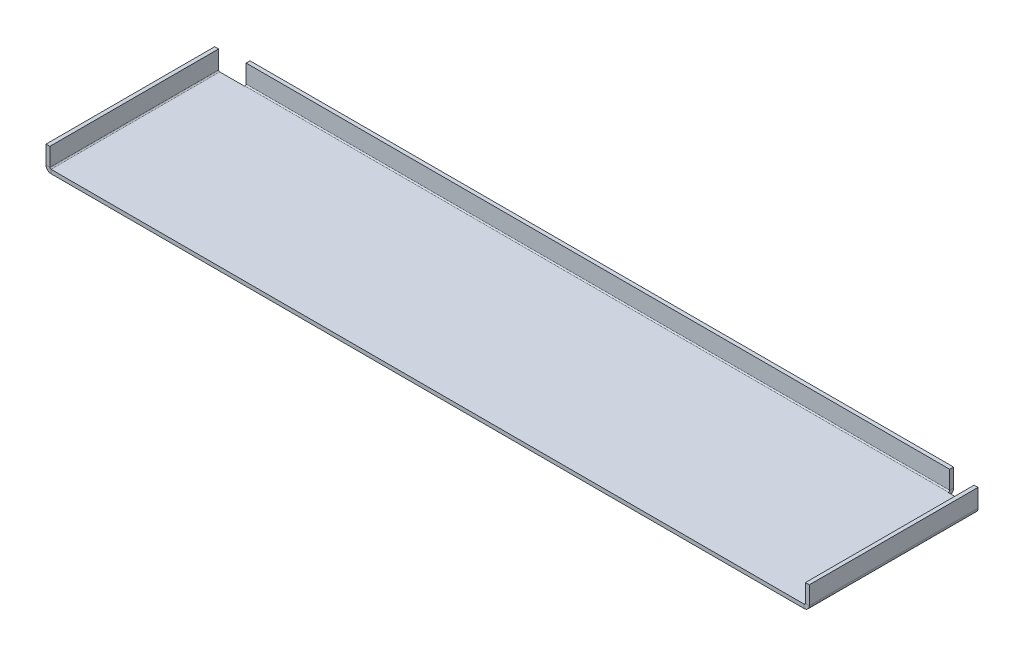
ISO-10303-21;
HEADER;
FILE_DESCRIPTION(('STEP AP214'),'2;1');
FILE_NAME('part.step','',(''),(''),'','','');
FILE_SCHEMA(('AUTOMOTIVE_DESIGN { 1 0 10303 214 1 1 1 1 }'));
ENDSEC;
DATA;
#1=APPLICATION_CONTEXT('core data for automotive mechanical design processes');
#2=APPLICATION_PROTOCOL_DEFINITION('international standard','automotive_design',2000,#1);
#3=PRODUCT_CONTEXT('',#1,'mechanical');
#4=PRODUCT('Part','Part','',(#3));
#5=PRODUCT_RELATED_PRODUCT_CATEGORY('part','',(#4));
#6=PRODUCT_DEFINITION_FORMATION('','',#4);
#7=PRODUCT_DEFINITION_CONTEXT('part definition',#1,'design');
#8=PRODUCT_DEFINITION('design','',#6,#7);
#9=PRODUCT_DEFINITION_SHAPE('','',#8);
#10=(LENGTH_UNIT() NAMED_UNIT(*) SI_UNIT(.MILLI.,.METRE.));
#11=(NAMED_UNIT(*) PLANE_ANGLE_UNIT() SI_UNIT($,.RADIAN.));
#12=(NAMED_UNIT(*) SI_UNIT($,.STERADIAN.) SOLID_ANGLE_UNIT());
#13=UNCERTAINTY_MEASURE_WITH_UNIT(LENGTH_MEASURE(1.E-05),#10,'distance_accuracy_value','');
#14=(GEOMETRIC_REPRESENTATION_CONTEXT(3) GLOBAL_UNCERTAINTY_ASSIGNED_CONTEXT((#13)) GLOBAL_UNIT_ASSIGNED_CONTEXT((#10,
#11,#12)) REPRESENTATION_CONTEXT('',''));
#15=CARTESIAN_POINT('',(0.,0.,0.));
#16=DIRECTION('',(0.,0.,1.));
#17=DIRECTION('',(1.,0.,0.));
#18=AXIS2_PLACEMENT_3D('',#15,#16,#17);
#19=CARTESIAN_POINT('',(-307.34,-3.175,-69.31025));
#20=DIRECTION('',(0.,0.,-1.));
#21=DIRECTION('',(-1.,0.,0.));
#22=AXIS2_PLACEMENT_3D('',#19,#20,#21);
#23=PLANE('',#22);
#24=DIRECTION('',(-1.,0.,0.));
#25=VECTOR('',#24,1.);
#26=CARTESIAN_POINT('',(-307.34,0.,-69.31025));
#27=LINE('',#26,#25);
#28=CARTESIAN_POINT('',(-289.068,0.,-69.31025));
#29=VERTEX_POINT('',#28);
#30=CARTESIAN_POINT('',(-309.388,0.,-69.31025));
#31=VERTEX_POINT('',#30);
#32=EDGE_CURVE('E421',#29,#31,#27,.T.);
#33=ORIENTED_EDGE('',*,*,#32,.F.);
#34=DIRECTION('',(0.,-1.,0.));
#35=VECTOR('',#34,1.);
#36=CARTESIAN_POINT('',(-289.068,0.,-69.31025));
#37=LINE('',#36,#35);
#38=CARTESIAN_POINT('',(-289.068,-3.175,-69.31025));
#39=VERTEX_POINT('',#38);
#40=EDGE_CURVE('E307',#29,#39,#37,.T.);
#41=ORIENTED_EDGE('',*,*,#40,.T.);
#42=DIRECTION('',(-1.,0.,0.));
#43=VECTOR('',#42,1.);
#44=CARTESIAN_POINT('',(-307.34,-3.175,-69.31025));
#45=LINE('',#44,#43);
#46=CARTESIAN_POINT('',(-309.388,-3.175,-69.31025));
#47=VERTEX_POINT('',#46);
#48=EDGE_CURVE('E120',#39,#47,#45,.T.);
#49=ORIENTED_EDGE('',*,*,#48,.T.);
#50=DIRECTION('',(0.,-1.,0.));
#51=VECTOR('',#50,1.);
#52=CARTESIAN_POINT('',(-309.388,0.,-69.31025));
#53=LINE('',#52,#51);
#54=EDGE_CURVE('E418',#31,#47,#53,.T.);
#55=ORIENTED_EDGE('',*,*,#54,.F.);
#56=EDGE_LOOP('',(#33,#41,#49,#55));
#57=FACE_BOUND('',#56,.T.);
#58=ADVANCED_FACE('F96',(#57),#23,.T.);
#59=CARTESIAN_POINT('',(-307.34,-3.175,69.31025));
#60=DIRECTION('',(0.,0.,1.));
#61=DIRECTION('',(1.,0.,0.));
#62=AXIS2_PLACEMENT_3D('',#59,#60,#61);
#63=PLANE('',#62);
#64=DIRECTION('',(1.,0.,0.));
#65=VECTOR('',#64,1.);
#66=CARTESIAN_POINT('',(-307.34,0.,69.31025));
#67=LINE('',#66,#65);
#68=CARTESIAN_POINT('',(-309.388,0.,69.31025));
#69=VERTEX_POINT('',#68);
#70=CARTESIAN_POINT('',(309.388,0.,69.31025));
#71=VERTEX_POINT('',#70);
#72=EDGE_CURVE('E100',#69,#71,#67,.T.);
#73=ORIENTED_EDGE('',*,*,#72,.F.);
#74=DIRECTION('',(0.,-1.,0.));
#75=VECTOR('',#74,1.);
#76=CARTESIAN_POINT('',(-309.388,0.,69.31025));
#77=LINE('',#76,#75);
#78=CARTESIAN_POINT('',(-309.388,-3.175,69.31025));
#79=VERTEX_POINT('',#78);
#80=EDGE_CURVE('E407',#69,#79,#77,.T.);
#81=ORIENTED_EDGE('',*,*,#80,.T.);
#82=DIRECTION('',(1.,0.,0.));
#83=VECTOR('',#82,1.);
#84=CARTESIAN_POINT('',(-307.34,-3.175,69.31025));
#85=LINE('',#84,#83);
#86=CARTESIAN_POINT('',(309.388,-3.175,69.31025));
#87=VERTEX_POINT('',#86);
#88=EDGE_CURVE('E13',#79,#87,#85,.T.);
#89=ORIENTED_EDGE('',*,*,#88,.T.);
#90=DIRECTION('',(0.,-1.,0.));
#91=VECTOR('',#90,1.);
#92=CARTESIAN_POINT('',(309.388,0.,69.31025));
#93=LINE('',#92,#91);
#94=EDGE_CURVE('E364',#71,#87,#93,.T.);
#95=ORIENTED_EDGE('',*,*,#94,.F.);
#96=EDGE_LOOP('',(#73,#81,#89,#95));
#97=FACE_BOUND('',#96,.T.);
#98=ADVANCED_FACE('F446',(#97),#63,.T.);
#99=DIRECTION('',(0.,-1.,0.));
#100=VECTOR('',#99,1.);
#101=CARTESIAN_POINT('',(289.068,0.,-69.31025));
#102=LINE('',#101,#100);
#103=CARTESIAN_POINT('',(289.068,0.,-69.31025));
#104=VERTEX_POINT('',#103);
#105=CARTESIAN_POINT('',(289.068,-3.175,-69.31025));
#106=VERTEX_POINT('',#105);
#107=EDGE_CURVE('E303',#104,#106,#102,.T.);
#108=ORIENTED_EDGE('',*,*,#107,.F.);
#109=CARTESIAN_POINT('',(309.388,0.,-69.31025));
#110=VERTEX_POINT('',#109);
#111=EDGE_CURVE('E425',#110,#104,#27,.T.);
#112=ORIENTED_EDGE('',*,*,#111,.F.);
#113=DIRECTION('',(0.,-1.,0.));
#114=VECTOR('',#113,1.);
#115=CARTESIAN_POINT('',(309.388,0.,-69.31025));
#116=LINE('',#115,#114);
#117=CARTESIAN_POINT('',(309.388,-3.175,-69.31025));
#118=VERTEX_POINT('',#117);
#119=EDGE_CURVE('E354',#110,#118,#116,.T.);
#120=ORIENTED_EDGE('',*,*,#119,.T.);
#121=EDGE_CURVE('E105',#118,#106,#45,.T.);
#122=ORIENTED_EDGE('',*,*,#121,.T.);
#123=EDGE_LOOP('',(#108,#112,#120,#122));
#124=FACE_BOUND('',#123,.T.);
#125=ADVANCED_FACE('F98',(#124),#23,.T.);
#126=CARTESIAN_POINT('',(0.,-3.175,0.));
#127=DIRECTION('',(0.,1.,0.));
#128=DIRECTION('',(0.,0.,1.));
#129=AXIS2_PLACEMENT_3D('',#126,#127,#128);
#130=PLANE('',#129);
#131=ORIENTED_EDGE('',*,*,#121,.F.);
#132=DIRECTION('',(0.,0.,-1.));
#133=VECTOR('',#132,1.);
#134=CARTESIAN_POINT('',(309.388,-3.175,-69.31025));
#135=LINE('',#134,#133);
#136=EDGE_CURVE('E347',#118,#87,#135,.F.);
#137=ORIENTED_EDGE('',*,*,#136,.T.);
#138=ORIENTED_EDGE('',*,*,#88,.F.);
#139=DIRECTION('',(0.,0.,1.));
#140=VECTOR('',#139,1.);
#141=CARTESIAN_POINT('',(-309.388,-3.175,69.31025));
#142=LINE('',#141,#140);
#143=EDGE_CURVE('E400',#79,#47,#142,.F.);
#144=ORIENTED_EDGE('',*,*,#143,.T.);
#145=ORIENTED_EDGE('',*,*,#48,.F.);
#146=DIRECTION('',(0.,0.,1.));
#147=VECTOR('',#146,1.);
#148=CARTESIAN_POINT('',(-289.068,-3.175,-69.58025));
#149=LINE('',#148,#147);
#150=CARTESIAN_POINT('',(-289.068,-3.175,-69.58025));
#151=VERTEX_POINT('',#150);
#152=EDGE_CURVE('E113',#151,#39,#149,.T.);
#153=ORIENTED_EDGE('',*,*,#152,.F.);
#154=DIRECTION('',(-1.,0.,0.));
#155=VECTOR('',#154,1.);
#156=CARTESIAN_POINT('',(-289.068,-3.175,-69.58025));
#157=LINE('',#156,#155);
#158=CARTESIAN_POINT('',(289.068,-3.175,-69.58025));
#159=VERTEX_POINT('',#158);
#160=EDGE_CURVE('E244',#151,#159,#157,.F.);
#161=ORIENTED_EDGE('',*,*,#160,.T.);
#162=DIRECTION('',(0.,0.,1.));
#163=VECTOR('',#162,1.);
#164=CARTESIAN_POINT('',(289.068,-3.175,-69.58025));
#165=LINE('',#164,#163);
#166=EDGE_CURVE('E310',#159,#106,#165,.T.);
#167=ORIENTED_EDGE('',*,*,#166,.T.);
#168=EDGE_LOOP('',(#131,#137,#138,#144,#145,#153,#161,#167));
#169=FACE_BOUND('',#168,.T.);
#170=ADVANCED_FACE('F452',(#169),#130,.F.);
#171=CARTESIAN_POINT('',(0.,0.,0.));
#172=DIRECTION('',(0.,1.,0.));
#173=DIRECTION('',(0.,0.,1.));
#174=AXIS2_PLACEMENT_3D('',#171,#172,#173);
#175=PLANE('',#174);
#176=ORIENTED_EDGE('',*,*,#72,.T.);
#177=DIRECTION('',(0.,0.,-1.));
#178=VECTOR('',#177,1.);
#179=CARTESIAN_POINT('',(309.388,0.,-69.31025));
#180=LINE('',#179,#178);
#181=EDGE_CURVE('E360',#110,#71,#180,.F.);
#182=ORIENTED_EDGE('',*,*,#181,.F.);
#183=ORIENTED_EDGE('',*,*,#111,.T.);
#184=DIRECTION('',(0.,0.,1.));
#185=VECTOR('',#184,1.);
#186=CARTESIAN_POINT('',(289.068,0.,-69.58025));
#187=LINE('',#186,#185);
#188=CARTESIAN_POINT('',(289.068,0.,-69.58025));
#189=VERTEX_POINT('',#188);
#190=EDGE_CURVE('E309',#189,#104,#187,.T.);
#191=ORIENTED_EDGE('',*,*,#190,.F.);
#192=DIRECTION('',(-1.,0.,0.));
#193=VECTOR('',#192,1.);
#194=CARTESIAN_POINT('',(-289.068,0.,-69.58025));
#195=LINE('',#194,#193);
#196=CARTESIAN_POINT('',(-289.068,0.,-69.58025));
#197=VERTEX_POINT('',#196);
#198=EDGE_CURVE('E297',#197,#189,#195,.F.);
#199=ORIENTED_EDGE('',*,*,#198,.F.);
#200=DIRECTION('',(0.,0.,1.));
#201=VECTOR('',#200,1.);
#202=CARTESIAN_POINT('',(-289.068,0.,-69.58025));
#203=LINE('',#202,#201);
#204=EDGE_CURVE('E313',#197,#29,#203,.T.);
#205=ORIENTED_EDGE('',*,*,#204,.T.);
#206=ORIENTED_EDGE('',*,*,#32,.T.);
#207=DIRECTION('',(0.,0.,1.));
#208=VECTOR('',#207,1.);
#209=CARTESIAN_POINT('',(-309.388,0.,69.31025));
#210=LINE('',#209,#208);
#211=EDGE_CURVE('E413',#69,#31,#210,.F.);
#212=ORIENTED_EDGE('',*,*,#211,.F.);
#213=EDGE_LOOP('',(#176,#182,#183,#191,#199,#205,#206,#212));
#214=FACE_BOUND('',#213,.T.);
#215=ADVANCED_FACE('F434',(#214),#175,.T.);
#216=CARTESIAN_POINT('',(-309.388,1.,-69.31025));
#217=DIRECTION('',(0.,0.,-1.));
#218=DIRECTION('',(-1.,0.,0.));
#219=AXIS2_PLACEMENT_3D('',#216,#217,#218);
#220=PLANE('',#219);
#221=DIRECTION('',(1.,0.,0.));
#222=VECTOR('',#221,1.);
#223=CARTESIAN_POINT('',(-313.563,0.99999999999999,-69.31025));
#224=LINE('',#223,#222);
#225=CARTESIAN_POINT('',(-310.388,1.,-69.31025));
#226=VERTEX_POINT('',#225);
#227=CARTESIAN_POINT('',(-313.563,0.99999999999999,-69.31025));
#228=VERTEX_POINT('',#227);
#229=EDGE_CURVE('E367',#226,#228,#224,.F.);
#230=ORIENTED_EDGE('',*,*,#229,.F.);
#231=CARTESIAN_POINT('',(-309.388,1.,-69.31025));
#232=DIRECTION('',(0.,0.,1.));
#233=DIRECTION('',(1.,0.,0.));
#234=AXIS2_PLACEMENT_3D('',#231,#232,#233);
#235=CIRCLE('',#234,1.);
#236=EDGE_CURVE('E410',#31,#226,#235,.F.);
#237=ORIENTED_EDGE('',*,*,#236,.F.);
#238=ORIENTED_EDGE('',*,*,#54,.T.);
#239=CARTESIAN_POINT('',(-309.388,1.,-69.31025));
#240=DIRECTION('',(0.,0.,1.));
#241=DIRECTION('',(1.,0.,0.));
#242=AXIS2_PLACEMENT_3D('',#239,#240,#241);
#243=CIRCLE('',#242,4.175);
#244=EDGE_CURVE('E403',#47,#228,#243,.F.);
#245=ORIENTED_EDGE('',*,*,#244,.T.);
#246=EDGE_LOOP('',(#230,#237,#238,#245));
#247=FACE_BOUND('',#246,.T.);
#248=ADVANCED_FACE('F444',(#247),#220,.T.);
#249=CARTESIAN_POINT('',(-309.388,1.,69.31025));
#250=DIRECTION('',(0.,0.,-1.));
#251=DIRECTION('',(-1.,0.,0.));
#252=AXIS2_PLACEMENT_3D('',#249,#250,#251);
#253=PLANE('',#252);
#254=CARTESIAN_POINT('',(-309.388,1.,69.31025));
#255=DIRECTION('',(0.,0.,1.));
#256=DIRECTION('',(1.,0.,0.));
#257=AXIS2_PLACEMENT_3D('',#254,#255,#256);
#258=CIRCLE('',#257,1.);
#259=CARTESIAN_POINT('',(-310.388,1.,69.31025));
#260=VERTEX_POINT('',#259);
#261=EDGE_CURVE('E373',#260,#69,#258,.T.);
#262=ORIENTED_EDGE('',*,*,#261,.F.);
#263=DIRECTION('',(1.,0.,0.));
#264=VECTOR('',#263,1.);
#265=CARTESIAN_POINT('',(-310.388,1.,69.31025));
#266=LINE('',#265,#264);
#267=CARTESIAN_POINT('',(-313.563,0.99999999999999,69.31025));
#268=VERTEX_POINT('',#267);
#269=EDGE_CURVE('E393',#260,#268,#266,.F.);
#270=ORIENTED_EDGE('',*,*,#269,.T.);
#271=CARTESIAN_POINT('',(-309.388,1.,69.31025));
#272=DIRECTION('',(0.,0.,1.));
#273=DIRECTION('',(1.,0.,0.));
#274=AXIS2_PLACEMENT_3D('',#271,#272,#273);
#275=CIRCLE('',#274,4.175);
#276=EDGE_CURVE('E404',#268,#79,#275,.T.);
#277=ORIENTED_EDGE('',*,*,#276,.T.);
#278=ORIENTED_EDGE('',*,*,#80,.F.);
#279=EDGE_LOOP('',(#262,#270,#277,#278));
#280=FACE_BOUND('',#279,.T.);
#281=ADVANCED_FACE('F562',(#280),#253,.F.);
#282=CARTESIAN_POINT('',(-309.388,1.,69.31025));
#283=DIRECTION('',(0.,0.,1.));
#284=DIRECTION('',(-1.,0.,0.));
#285=AXIS2_PLACEMENT_3D('',#282,#283,#284);
#286=CYLINDRICAL_SURFACE('',#285,4.175);
#287=ORIENTED_EDGE('',*,*,#143,.F.);
#288=ORIENTED_EDGE('',*,*,#276,.F.);
#289=DIRECTION('',(0.,0.,1.));
#290=VECTOR('',#289,1.);
#291=CARTESIAN_POINT('',(-313.563,0.99999999999999,-69.31025));
#292=LINE('',#291,#290);
#293=EDGE_CURVE('E391',#268,#228,#292,.F.);
#294=ORIENTED_EDGE('',*,*,#293,.T.);
#295=ORIENTED_EDGE('',*,*,#244,.F.);
#296=EDGE_LOOP('',(#287,#288,#294,#295));
#297=FACE_BOUND('',#296,.T.);
#298=ADVANCED_FACE('F559',(#297),#286,.T.);
#299=CARTESIAN_POINT('',(-309.388,1.,69.31025));
#300=DIRECTION('',(0.,0.,1.));
#301=DIRECTION('',(-1.,0.,0.));
#302=AXIS2_PLACEMENT_3D('',#299,#300,#301);
#303=CYLINDRICAL_SURFACE('',#302,1.);
#304=ORIENTED_EDGE('',*,*,#211,.T.);
#305=ORIENTED_EDGE('',*,*,#236,.T.);
#306=DIRECTION('',(0.,0.,1.));
#307=VECTOR('',#306,1.);
#308=CARTESIAN_POINT('',(-310.388,1.,-69.31025));
#309=LINE('',#308,#307);
#310=EDGE_CURVE('E396',#226,#260,#309,.T.);
#311=ORIENTED_EDGE('',*,*,#310,.T.);
#312=ORIENTED_EDGE('',*,*,#261,.T.);
#313=EDGE_LOOP('',(#304,#305,#311,#312));
#314=FACE_BOUND('',#313,.T.);
#315=ADVANCED_FACE('F439',(#314),#303,.F.);
#316=CARTESIAN_POINT('',(-313.563,0.,-69.31025));
#317=DIRECTION('',(0.,0.,1.));
#318=DIRECTION('',(0.,-1.,0.));
#319=AXIS2_PLACEMENT_3D('',#316,#317,#318);
#320=PLANE('',#319);
#321=ORIENTED_EDGE('',*,*,#229,.T.);
#322=DIRECTION('',(0.,-1.,0.));
#323=VECTOR('',#322,1.);
#324=CARTESIAN_POINT('',(-313.563,-1.32814302736365E-12,-69.31025));
#325=LINE('',#324,#323);
#326=CARTESIAN_POINT('',(-313.563,15.875,-69.31025));
#327=VERTEX_POINT('',#326);
#328=EDGE_CURVE('E381',#327,#228,#325,.T.);
#329=ORIENTED_EDGE('',*,*,#328,.F.);
#330=DIRECTION('',(1.,0.,0.));
#331=VECTOR('',#330,1.);
#332=CARTESIAN_POINT('',(-313.563,15.875,-69.31025));
#333=LINE('',#332,#331);
#334=CARTESIAN_POINT('',(-310.388,15.875,-69.31025));
#335=VERTEX_POINT('',#334);
#336=EDGE_CURVE('E374',#327,#335,#333,.T.);
#337=ORIENTED_EDGE('',*,*,#336,.T.);
#338=DIRECTION('',(0.,1.,0.));
#339=VECTOR('',#338,1.);
#340=CARTESIAN_POINT('',(-310.388,0.,-69.31025));
#341=LINE('',#340,#339);
#342=EDGE_CURVE('E388',#335,#226,#341,.F.);
#343=ORIENTED_EDGE('',*,*,#342,.T.);
#344=EDGE_LOOP('',(#321,#329,#337,#343));
#345=FACE_BOUND('',#344,.T.);
#346=ADVANCED_FACE('F554',(#345),#320,.F.);
#347=CARTESIAN_POINT('',(-313.563,15.875,69.3102499999999));
#348=DIRECTION('',(0.,0.,-1.));
#349=DIRECTION('',(0.,1.,0.));
#350=AXIS2_PLACEMENT_3D('',#347,#348,#349);
#351=PLANE('',#350);
#352=ORIENTED_EDGE('',*,*,#269,.F.);
#353=DIRECTION('',(0.,-1.,0.));
#354=VECTOR('',#353,1.);
#355=CARTESIAN_POINT('',(-310.388,15.875,69.3102499999999));
#356=LINE('',#355,#354);
#357=CARTESIAN_POINT('',(-310.388,15.875,69.3102499999999));
#358=VERTEX_POINT('',#357);
#359=EDGE_CURVE('E386',#260,#358,#356,.F.);
#360=ORIENTED_EDGE('',*,*,#359,.T.);
#361=DIRECTION('',(1.,0.,0.));
#362=VECTOR('',#361,1.);
#363=CARTESIAN_POINT('',(-313.563,15.875,69.3102499999999));
#364=LINE('',#363,#362);
#365=CARTESIAN_POINT('',(-313.563,15.875,69.3102499999999));
#366=VERTEX_POINT('',#365);
#367=EDGE_CURVE('E370',#366,#358,#364,.T.);
#368=ORIENTED_EDGE('',*,*,#367,.F.);
#369=DIRECTION('',(0.,1.,0.));
#370=VECTOR('',#369,1.);
#371=CARTESIAN_POINT('',(-313.563,-8.43419654812306E-13,69.31025));
#372=LINE('',#371,#370);
#373=EDGE_CURVE('E379',#268,#366,#372,.T.);
#374=ORIENTED_EDGE('',*,*,#373,.F.);
#375=EDGE_LOOP('',(#352,#360,#368,#374));
#376=FACE_BOUND('',#375,.T.);
#377=ADVANCED_FACE('F544',(#376),#351,.F.);
#378=CARTESIAN_POINT('',(-313.563,-1.08578134108798E-12,0.));
#379=DIRECTION('',(1.,0.,0.));
#380=DIRECTION('',(0.,1.,0.));
#381=AXIS2_PLACEMENT_3D('',#378,#379,#380);
#382=PLANE('',#381);
#383=ORIENTED_EDGE('',*,*,#293,.F.);
#384=ORIENTED_EDGE('',*,*,#373,.T.);
#385=DIRECTION('',(0.,0.,-1.));
#386=VECTOR('',#385,1.);
#387=CARTESIAN_POINT('',(-313.563,15.875,0.));
#388=LINE('',#387,#386);
#389=EDGE_CURVE('E377',#366,#327,#388,.T.);
#390=ORIENTED_EDGE('',*,*,#389,.T.);
#391=ORIENTED_EDGE('',*,*,#328,.T.);
#392=EDGE_LOOP('',(#383,#384,#390,#391));
#393=FACE_BOUND('',#392,.T.);
#394=ADVANCED_FACE('F540',(#393),#382,.F.);
#395=CARTESIAN_POINT('',(-310.388,-1.07469588783715E-12,0.));
#396=DIRECTION('',(1.,0.,0.));
#397=DIRECTION('',(0.,1.,0.));
#398=AXIS2_PLACEMENT_3D('',#395,#396,#397);
#399=PLANE('',#398);
#400=ORIENTED_EDGE('',*,*,#359,.F.);
#401=ORIENTED_EDGE('',*,*,#310,.F.);
#402=ORIENTED_EDGE('',*,*,#342,.F.);
#403=DIRECTION('',(0.,0.,1.));
#404=VECTOR('',#403,1.);
#405=CARTESIAN_POINT('',(-310.388,15.875,-69.31025));
#406=LINE('',#405,#404);
#407=EDGE_CURVE('E384',#358,#335,#406,.F.);
#408=ORIENTED_EDGE('',*,*,#407,.F.);
#409=EDGE_LOOP('',(#400,#401,#402,#408));
#410=FACE_BOUND('',#409,.T.);
#411=ADVANCED_FACE('F543',(#410),#399,.T.);
#412=CARTESIAN_POINT('',(-313.563,15.875,-69.31025));
#413=DIRECTION('',(0.,-1.,0.));
#414=DIRECTION('',(1.,0.,0.));
#415=AXIS2_PLACEMENT_3D('',#412,#413,#414);
#416=PLANE('',#415);
#417=ORIENTED_EDGE('',*,*,#407,.T.);
#418=ORIENTED_EDGE('',*,*,#336,.F.);
#419=ORIENTED_EDGE('',*,*,#389,.F.);
#420=ORIENTED_EDGE('',*,*,#367,.T.);
#421=EDGE_LOOP('',(#417,#418,#419,#420));
#422=FACE_BOUND('',#421,.T.);
#423=ADVANCED_FACE('F535',(#422),#416,.F.);
#424=CARTESIAN_POINT('',(309.388,1.,69.31025));
#425=DIRECTION('',(0.,0.,1.));
#426=DIRECTION('',(1.,0.,0.));
#427=AXIS2_PLACEMENT_3D('',#424,#425,#426);
#428=PLANE('',#427);
#429=DIRECTION('',(-1.,0.,0.));
#430=VECTOR('',#429,1.);
#431=CARTESIAN_POINT('',(313.563,0.99999999999999,69.31025));
#432=LINE('',#431,#430);
#433=CARTESIAN_POINT('',(310.388,1.,69.31025));
#434=VERTEX_POINT('',#433);
#435=CARTESIAN_POINT('',(313.563,0.99999999999999,69.31025));
#436=VERTEX_POINT('',#435);
#437=EDGE_CURVE('E315',#434,#436,#432,.F.);
#438=ORIENTED_EDGE('',*,*,#437,.F.);
#439=CARTESIAN_POINT('',(309.388,1.,69.31025));
#440=DIRECTION('',(0.,0.,-1.));
#441=DIRECTION('',(-1.,0.,0.));
#442=AXIS2_PLACEMENT_3D('',#439,#440,#441);
#443=CIRCLE('',#442,1.);
#444=EDGE_CURVE('E357',#71,#434,#443,.F.);
#445=ORIENTED_EDGE('',*,*,#444,.F.);
#446=ORIENTED_EDGE('',*,*,#94,.T.);
#447=CARTESIAN_POINT('',(309.388,1.,69.31025));
#448=DIRECTION('',(0.,0.,-1.));
#449=DIRECTION('',(-1.,0.,0.));
#450=AXIS2_PLACEMENT_3D('',#447,#448,#449);
#451=CIRCLE('',#450,4.175);
#452=EDGE_CURVE('E350',#87,#436,#451,.F.);
#453=ORIENTED_EDGE('',*,*,#452,.T.);
#454=EDGE_LOOP('',(#438,#445,#446,#453));
#455=FACE_BOUND('',#454,.T.);
#456=ADVANCED_FACE('F532',(#455),#428,.T.);
#457=CARTESIAN_POINT('',(309.388,1.,-69.31025));
#458=DIRECTION('',(0.,0.,1.));
#459=DIRECTION('',(1.,0.,0.));
#460=AXIS2_PLACEMENT_3D('',#457,#458,#459);
#461=PLANE('',#460);
#462=CARTESIAN_POINT('',(309.388,1.,-69.31025));
#463=DIRECTION('',(0.,0.,-1.));
#464=DIRECTION('',(-1.,0.,0.));
#465=AXIS2_PLACEMENT_3D('',#462,#463,#464);
#466=CIRCLE('',#465,1.);
#467=CARTESIAN_POINT('',(310.388,1.,-69.31025));
#468=VERTEX_POINT('',#467);
#469=EDGE_CURVE('E320',#468,#110,#466,.T.);
#470=ORIENTED_EDGE('',*,*,#469,.F.);
#471=DIRECTION('',(-1.,0.,0.));
#472=VECTOR('',#471,1.);
#473=CARTESIAN_POINT('',(310.388,1.,-69.31025));
#474=LINE('',#473,#472);
#475=CARTESIAN_POINT('',(313.563,0.99999999999999,-69.31025));
#476=VERTEX_POINT('',#475);
#477=EDGE_CURVE('E340',#468,#476,#474,.F.);
#478=ORIENTED_EDGE('',*,*,#477,.T.);
#479=CARTESIAN_POINT('',(309.388,1.,-69.31025));
#480=DIRECTION('',(0.,0.,-1.));
#481=DIRECTION('',(-1.,0.,0.));
#482=AXIS2_PLACEMENT_3D('',#479,#480,#481);
#483=CIRCLE('',#482,4.175);
#484=EDGE_CURVE('E351',#476,#118,#483,.T.);
#485=ORIENTED_EDGE('',*,*,#484,.T.);
#486=ORIENTED_EDGE('',*,*,#119,.F.);
#487=EDGE_LOOP('',(#470,#478,#485,#486));
#488=FACE_BOUND('',#487,.T.);
#489=ADVANCED_FACE('F527',(#488),#461,.F.);
#490=CARTESIAN_POINT('',(309.388,1.,-69.31025));
#491=DIRECTION('',(0.,0.,-1.));
#492=DIRECTION('',(1.,0.,0.));
#493=AXIS2_PLACEMENT_3D('',#490,#491,#492);
#494=CYLINDRICAL_SURFACE('',#493,4.175);
#495=ORIENTED_EDGE('',*,*,#136,.F.);
#496=ORIENTED_EDGE('',*,*,#484,.F.);
#497=DIRECTION('',(0.,0.,-1.));
#498=VECTOR('',#497,1.);
#499=CARTESIAN_POINT('',(313.563,0.99999999999999,69.31025));
#500=LINE('',#499,#498);
#501=EDGE_CURVE('E338',#476,#436,#500,.F.);
#502=ORIENTED_EDGE('',*,*,#501,.T.);
#503=ORIENTED_EDGE('',*,*,#452,.F.);
#504=EDGE_LOOP('',(#495,#496,#502,#503));
#505=FACE_BOUND('',#504,.T.);
#506=ADVANCED_FACE('F524',(#505),#494,.T.);
#507=CARTESIAN_POINT('',(309.388,1.,-69.31025));
#508=DIRECTION('',(0.,0.,-1.));
#509=DIRECTION('',(1.,0.,0.));
#510=AXIS2_PLACEMENT_3D('',#507,#508,#509);
#511=CYLINDRICAL_SURFACE('',#510,1.);
#512=ORIENTED_EDGE('',*,*,#181,.T.);
#513=ORIENTED_EDGE('',*,*,#444,.T.);
#514=DIRECTION('',(0.,0.,-1.));
#515=VECTOR('',#514,1.);
#516=CARTESIAN_POINT('',(310.388,1.,69.31025));
#517=LINE('',#516,#515);
#518=EDGE_CURVE('E343',#434,#468,#517,.T.);
#519=ORIENTED_EDGE('',*,*,#518,.T.);
#520=ORIENTED_EDGE('',*,*,#469,.T.);
#521=EDGE_LOOP('',(#512,#513,#519,#520));
#522=FACE_BOUND('',#521,.T.);
#523=ADVANCED_FACE('F522',(#522),#511,.F.);
#524=CARTESIAN_POINT('',(313.563,0.,69.31025));
#525=DIRECTION('',(0.,0.,-1.));
#526=DIRECTION('',(0.,1.,0.));
#527=AXIS2_PLACEMENT_3D('',#524,#525,#526);
#528=PLANE('',#527);
#529=ORIENTED_EDGE('',*,*,#437,.T.);
#530=DIRECTION('',(0.,-1.,0.));
#531=VECTOR('',#530,1.);
#532=CARTESIAN_POINT('',(313.563,-1.32814302736365E-12,69.31025));
#533=LINE('',#532,#531);
#534=CARTESIAN_POINT('',(313.563,15.875,69.31025));
#535=VERTEX_POINT('',#534);
#536=EDGE_CURVE('E328',#535,#436,#533,.T.);
#537=ORIENTED_EDGE('',*,*,#536,.F.);
#538=DIRECTION('',(-1.,0.,0.));
#539=VECTOR('',#538,1.);
#540=CARTESIAN_POINT('',(313.563,15.875,69.31025));
#541=LINE('',#540,#539);
#542=CARTESIAN_POINT('',(310.388,15.875,69.31025));
#543=VERTEX_POINT('',#542);
#544=EDGE_CURVE('E321',#535,#543,#541,.T.);
#545=ORIENTED_EDGE('',*,*,#544,.T.);
#546=DIRECTION('',(0.,1.,0.));
#547=VECTOR('',#546,1.);
#548=CARTESIAN_POINT('',(310.388,0.,69.31025));
#549=LINE('',#548,#547);
#550=EDGE_CURVE('E335',#543,#434,#549,.F.);
#551=ORIENTED_EDGE('',*,*,#550,.T.);
#552=EDGE_LOOP('',(#529,#537,#545,#551));
#553=FACE_BOUND('',#552,.T.);
#554=ADVANCED_FACE('F518',(#553),#528,.F.);
#555=CARTESIAN_POINT('',(313.563,15.875,-69.3102499999999));
#556=DIRECTION('',(0.,0.,1.));
#557=DIRECTION('',(0.,-1.,0.));
#558=AXIS2_PLACEMENT_3D('',#555,#556,#557);
#559=PLANE('',#558);
#560=ORIENTED_EDGE('',*,*,#477,.F.);
#561=DIRECTION('',(0.,-1.,0.));
#562=VECTOR('',#561,1.);
#563=CARTESIAN_POINT('',(310.388,15.875,-69.3102499999999));
#564=LINE('',#563,#562);
#565=CARTESIAN_POINT('',(310.388,15.875,-69.3102499999999));
#566=VERTEX_POINT('',#565);
#567=EDGE_CURVE('E333',#468,#566,#564,.F.);
#568=ORIENTED_EDGE('',*,*,#567,.T.);
#569=DIRECTION('',(-1.,0.,0.));
#570=VECTOR('',#569,1.);
#571=CARTESIAN_POINT('',(313.563,15.875,-69.3102499999999));
#572=LINE('',#571,#570);
#573=CARTESIAN_POINT('',(313.563,15.875,-69.3102499999999));
#574=VERTEX_POINT('',#573);
#575=EDGE_CURVE('E317',#574,#566,#572,.T.);
#576=ORIENTED_EDGE('',*,*,#575,.F.);
#577=DIRECTION('',(0.,1.,0.));
#578=VECTOR('',#577,1.);
#579=CARTESIAN_POINT('',(313.563,-8.43419654812306E-13,-69.31025));
#580=LINE('',#579,#578);
#581=EDGE_CURVE('E326',#476,#574,#580,.T.);
#582=ORIENTED_EDGE('',*,*,#581,.F.);
#583=EDGE_LOOP('',(#560,#568,#576,#582));
#584=FACE_BOUND('',#583,.T.);
#585=ADVANCED_FACE('F508',(#584),#559,.F.);
#586=CARTESIAN_POINT('',(313.563,-1.08578134108798E-12,0.));
#587=DIRECTION('',(-1.,0.,0.));
#588=DIRECTION('',(0.,-1.,0.));
#589=AXIS2_PLACEMENT_3D('',#586,#587,#588);
#590=PLANE('',#589);
#591=ORIENTED_EDGE('',*,*,#501,.F.);
#592=ORIENTED_EDGE('',*,*,#581,.T.);
#593=DIRECTION('',(0.,0.,1.));
#594=VECTOR('',#593,1.);
#595=CARTESIAN_POINT('',(313.563,15.875,0.));
#596=LINE('',#595,#594);
#597=EDGE_CURVE('E324',#574,#535,#596,.T.);
#598=ORIENTED_EDGE('',*,*,#597,.T.);
#599=ORIENTED_EDGE('',*,*,#536,.T.);
#600=EDGE_LOOP('',(#591,#592,#598,#599));
#601=FACE_BOUND('',#600,.T.);
#602=ADVANCED_FACE('F504',(#601),#590,.F.);
#603=CARTESIAN_POINT('',(310.388,-1.07469588783715E-12,0.));
#604=DIRECTION('',(-1.,0.,0.));
#605=DIRECTION('',(0.,-1.,0.));
#606=AXIS2_PLACEMENT_3D('',#603,#604,#605);
#607=PLANE('',#606);
#608=ORIENTED_EDGE('',*,*,#567,.F.);
#609=ORIENTED_EDGE('',*,*,#518,.F.);
#610=ORIENTED_EDGE('',*,*,#550,.F.);
#611=DIRECTION('',(0.,0.,-1.));
#612=VECTOR('',#611,1.);
#613=CARTESIAN_POINT('',(310.388,15.875,69.31025));
#614=LINE('',#613,#612);
#615=EDGE_CURVE('E331',#566,#543,#614,.F.);
#616=ORIENTED_EDGE('',*,*,#615,.F.);
#617=EDGE_LOOP('',(#608,#609,#610,#616));
#618=FACE_BOUND('',#617,.T.);
#619=ADVANCED_FACE('F507',(#618),#607,.T.);
#620=CARTESIAN_POINT('',(313.563,15.875,69.31025));
#621=DIRECTION('',(0.,-1.,0.));
#622=DIRECTION('',(1.,0.,0.));
#623=AXIS2_PLACEMENT_3D('',#620,#621,#622);
#624=PLANE('',#623);
#625=ORIENTED_EDGE('',*,*,#615,.T.);
#626=ORIENTED_EDGE('',*,*,#544,.F.);
#627=ORIENTED_EDGE('',*,*,#597,.F.);
#628=ORIENTED_EDGE('',*,*,#575,.T.);
#629=EDGE_LOOP('',(#625,#626,#627,#628));
#630=FACE_BOUND('',#629,.T.);
#631=ADVANCED_FACE('F503',(#630),#624,.F.);
#632=CARTESIAN_POINT('',(-289.068,0.,-69.58025));
#633=DIRECTION('',(-1.,0.,0.));
#634=DIRECTION('',(0.,-1.,0.));
#635=AXIS2_PLACEMENT_3D('',#632,#633,#634);
#636=PLANE('',#635);
#637=ORIENTED_EDGE('',*,*,#204,.F.);
#638=DIRECTION('',(0.,-1.,0.));
#639=VECTOR('',#638,1.);
#640=CARTESIAN_POINT('',(-289.068,0.,-69.58025));
#641=LINE('',#640,#639);
#642=EDGE_CURVE('E293',#197,#151,#641,.T.);
#643=ORIENTED_EDGE('',*,*,#642,.T.);
#644=ORIENTED_EDGE('',*,*,#152,.T.);
#645=ORIENTED_EDGE('',*,*,#40,.F.);
#646=EDGE_LOOP('',(#637,#643,#644,#645));
#647=FACE_BOUND('',#646,.T.);
#648=ADVANCED_FACE('F500',(#647),#636,.T.);
#649=CARTESIAN_POINT('',(289.068,0.,-69.58025));
#650=DIRECTION('',(-1.,0.,0.));
#651=DIRECTION('',(0.,-1.,0.));
#652=AXIS2_PLACEMENT_3D('',#649,#650,#651);
#653=PLANE('',#652);
#654=ORIENTED_EDGE('',*,*,#166,.F.);
#655=DIRECTION('',(0.,-1.,0.));
#656=VECTOR('',#655,1.);
#657=CARTESIAN_POINT('',(289.068,0.,-69.58025));
#658=LINE('',#657,#656);
#659=EDGE_CURVE('E300',#189,#159,#658,.T.);
#660=ORIENTED_EDGE('',*,*,#659,.F.);
#661=ORIENTED_EDGE('',*,*,#190,.T.);
#662=ORIENTED_EDGE('',*,*,#107,.T.);
#663=EDGE_LOOP('',(#654,#660,#661,#662));
#664=FACE_BOUND('',#663,.T.);
#665=ADVANCED_FACE('F463',(#664),#653,.F.);
#666=CARTESIAN_POINT('',(289.068,1.,-69.58025));
#667=DIRECTION('',(1.,0.,0.));
#668=DIRECTION('',(0.,0.,-1.));
#669=AXIS2_PLACEMENT_3D('',#666,#667,#668);
#670=PLANE('',#669);
#671=DIRECTION('',(0.,0.,-1.));
#672=VECTOR('',#671,1.);
#673=CARTESIAN_POINT('',(289.068,1.00000000000002,-73.7552500000001));
#674=LINE('',#673,#672);
#675=CARTESIAN_POINT('',(289.068,1.,-70.58025));
#676=VERTEX_POINT('',#675);
#677=CARTESIAN_POINT('',(289.068,1.,-73.75525));
#678=VERTEX_POINT('',#677);
#679=EDGE_CURVE('E288',#676,#678,#674,.T.);
#680=ORIENTED_EDGE('',*,*,#679,.F.);
#681=CARTESIAN_POINT('',(289.068,1.,-69.58025));
#682=DIRECTION('',(-1.,0.,0.));
#683=DIRECTION('',(0.,0.,1.));
#684=AXIS2_PLACEMENT_3D('',#681,#682,#683);
#685=CIRCLE('',#684,1.);
#686=EDGE_CURVE('E246',#189,#676,#685,.F.);
#687=ORIENTED_EDGE('',*,*,#686,.F.);
#688=ORIENTED_EDGE('',*,*,#659,.T.);
#689=CARTESIAN_POINT('',(289.068,1.,-69.58025));
#690=DIRECTION('',(-1.,0.,0.));
#691=DIRECTION('',(0.,0.,1.));
#692=AXIS2_PLACEMENT_3D('',#689,#690,#691);
#693=CIRCLE('',#692,4.175);
#694=EDGE_CURVE('E292',#159,#678,#693,.F.);
#695=ORIENTED_EDGE('',*,*,#694,.T.);
#696=EDGE_LOOP('',(#680,#687,#688,#695));
#697=FACE_BOUND('',#696,.T.);
#698=ADVANCED_FACE('F470',(#697),#670,.T.);
#699=CARTESIAN_POINT('',(-289.068,1.,-69.58025));
#700=DIRECTION('',(1.,0.,0.));
#701=DIRECTION('',(0.,0.,-1.));
#702=AXIS2_PLACEMENT_3D('',#699,#700,#701);
#703=PLANE('',#702);
#704=CARTESIAN_POINT('',(-289.068,1.,-69.58025));
#705=DIRECTION('',(-1.,0.,0.));
#706=DIRECTION('',(0.,0.,1.));
#707=AXIS2_PLACEMENT_3D('',#704,#705,#706);
#708=CIRCLE('',#707,1.);
#709=CARTESIAN_POINT('',(-289.068,1.,-70.58025));
#710=VERTEX_POINT('',#709);
#711=EDGE_CURVE('E253',#710,#197,#708,.T.);
#712=ORIENTED_EDGE('',*,*,#711,.F.);
#713=DIRECTION('',(0.,0.,-1.));
#714=VECTOR('',#713,1.);
#715=CARTESIAN_POINT('',(-289.068,1.00000000000001,-70.58025));
#716=LINE('',#715,#714);
#717=CARTESIAN_POINT('',(-289.068,1.00000000000004,-73.75525));
#718=VERTEX_POINT('',#717);
#719=EDGE_CURVE('E250',#710,#718,#716,.T.);
#720=ORIENTED_EDGE('',*,*,#719,.T.);
#721=CARTESIAN_POINT('',(-289.068,1.,-69.58025));
#722=DIRECTION('',(-1.,0.,0.));
#723=DIRECTION('',(0.,0.,1.));
#724=AXIS2_PLACEMENT_3D('',#721,#722,#723);
#725=CIRCLE('',#724,4.175);
#726=EDGE_CURVE('E237',#718,#151,#725,.T.);
#727=ORIENTED_EDGE('',*,*,#726,.T.);
#728=ORIENTED_EDGE('',*,*,#642,.F.);
#729=EDGE_LOOP('',(#712,#720,#727,#728));
#730=FACE_BOUND('',#729,.T.);
#731=ADVANCED_FACE('F251',(#730),#703,.F.);
#732=CARTESIAN_POINT('',(-289.068,1.,-69.58025));
#733=DIRECTION('',(-1.,0.,0.));
#734=DIRECTION('',(0.,0.,-1.));
#735=AXIS2_PLACEMENT_3D('',#732,#733,#734);
#736=CYLINDRICAL_SURFACE('',#735,4.175);
#737=ORIENTED_EDGE('',*,*,#160,.F.);
#738=ORIENTED_EDGE('',*,*,#726,.F.);
#739=DIRECTION('',(-1.,0.,0.));
#740=VECTOR('',#739,1.);
#741=CARTESIAN_POINT('',(0.,1.00000000000003,-73.75525));
#742=LINE('',#741,#740);
#743=EDGE_CURVE('E241',#678,#718,#742,.T.);
#744=ORIENTED_EDGE('',*,*,#743,.F.);
#745=ORIENTED_EDGE('',*,*,#694,.F.);
#746=EDGE_LOOP('',(#737,#738,#744,#745));
#747=FACE_BOUND('',#746,.T.);
#748=ADVANCED_FACE('F239',(#747),#736,.T.);
#749=CARTESIAN_POINT('',(-289.068,1.,-69.58025));
#750=DIRECTION('',(-1.,0.,0.));
#751=DIRECTION('',(0.,0.,-1.));
#752=AXIS2_PLACEMENT_3D('',#749,#750,#751);
#753=CYLINDRICAL_SURFACE('',#752,1.);
#754=ORIENTED_EDGE('',*,*,#198,.T.);
#755=ORIENTED_EDGE('',*,*,#686,.T.);
#756=DIRECTION('',(1.,0.,0.));
#757=VECTOR('',#756,1.);
#758=CARTESIAN_POINT('',(289.068,1.,-70.58025));
#759=LINE('',#758,#757);
#760=EDGE_CURVE('E258',#676,#710,#759,.F.);
#761=ORIENTED_EDGE('',*,*,#760,.T.);
#762=ORIENTED_EDGE('',*,*,#711,.T.);
#763=EDGE_LOOP('',(#754,#755,#761,#762));
#764=FACE_BOUND('',#763,.T.);
#765=ADVANCED_FACE('F467',(#764),#753,.F.);
#766=CARTESIAN_POINT('',(-289.068,0.,-73.75525));
#767=DIRECTION('',(-1.,0.,0.));
#768=DIRECTION('',(0.,0.,1.));
#769=AXIS2_PLACEMENT_3D('',#766,#767,#768);
#770=PLANE('',#769);
#771=DIRECTION('',(0.,-1.,0.));
#772=VECTOR('',#771,1.);
#773=CARTESIAN_POINT('',(-289.068,0.,-73.75525));
#774=LINE('',#773,#772);
#775=CARTESIAN_POINT('',(-289.068,15.875,-73.75525));
#776=VERTEX_POINT('',#775);
#777=EDGE_CURVE('E265',#776,#718,#774,.T.);
#778=ORIENTED_EDGE('',*,*,#777,.T.);
#779=ORIENTED_EDGE('',*,*,#719,.F.);
#780=DIRECTION('',(0.,1.,0.));
#781=VECTOR('',#780,1.);
#782=CARTESIAN_POINT('',(-289.068,0.,-70.58025));
#783=LINE('',#782,#781);
#784=CARTESIAN_POINT('',(-289.068,15.875,-70.58025));
#785=VERTEX_POINT('',#784);
#786=EDGE_CURVE('E281',#785,#710,#783,.F.);
#787=ORIENTED_EDGE('',*,*,#786,.F.);
#788=DIRECTION('',(0.,0.,1.));
#789=VECTOR('',#788,1.);
#790=CARTESIAN_POINT('',(-289.068,15.875,-73.75525));
#791=LINE('',#790,#789);
#792=EDGE_CURVE('E270',#776,#785,#791,.T.);
#793=ORIENTED_EDGE('',*,*,#792,.F.);
#794=EDGE_LOOP('',(#778,#779,#787,#793));
#795=FACE_BOUND('',#794,.T.);
#796=ADVANCED_FACE('F269',(#795),#770,.T.);
#797=CARTESIAN_POINT('',(289.068,15.875,-73.75525));
#798=DIRECTION('',(1.,0.,0.));
#799=DIRECTION('',(0.,0.,-1.));
#800=AXIS2_PLACEMENT_3D('',#797,#798,#799);
#801=PLANE('',#800);
#802=DIRECTION('',(0.,-1.,0.));
#803=VECTOR('',#802,1.);
#804=CARTESIAN_POINT('',(289.068,0.,-70.58025));
#805=LINE('',#804,#803);
#806=CARTESIAN_POINT('',(289.068,15.875,-70.58025));
#807=VERTEX_POINT('',#806);
#808=EDGE_CURVE('E267',#676,#807,#805,.F.);
#809=ORIENTED_EDGE('',*,*,#808,.F.);
#810=ORIENTED_EDGE('',*,*,#679,.T.);
#811=DIRECTION('',(0.,1.,0.));
#812=VECTOR('',#811,1.);
#813=CARTESIAN_POINT('',(289.068,15.875,-73.75525));
#814=LINE('',#813,#812);
#815=CARTESIAN_POINT('',(289.068,15.875,-73.75525));
#816=VERTEX_POINT('',#815);
#817=EDGE_CURVE('E266',#678,#816,#814,.T.);
#818=ORIENTED_EDGE('',*,*,#817,.T.);
#819=DIRECTION('',(0.,0.,1.));
#820=VECTOR('',#819,1.);
#821=CARTESIAN_POINT('',(289.068,15.875,-73.75525));
#822=LINE('',#821,#820);
#823=EDGE_CURVE('E272',#816,#807,#822,.T.);
#824=ORIENTED_EDGE('',*,*,#823,.T.);
#825=EDGE_LOOP('',(#809,#810,#818,#824));
#826=FACE_BOUND('',#825,.T.);
#827=ADVANCED_FACE('F473',(#826),#801,.T.);
#828=CARTESIAN_POINT('',(0.,0.,-73.75525));
#829=DIRECTION('',(0.,0.,-1.));
#830=DIRECTION('',(-1.,0.,0.));
#831=AXIS2_PLACEMENT_3D('',#828,#829,#830);
#832=PLANE('',#831);
#833=ORIENTED_EDGE('',*,*,#817,.F.);
#834=ORIENTED_EDGE('',*,*,#743,.T.);
#835=ORIENTED_EDGE('',*,*,#777,.F.);
#836=DIRECTION('',(-1.,0.,0.));
#837=VECTOR('',#836,1.);
#838=CARTESIAN_POINT('',(-289.068,15.875,-73.75525));
#839=LINE('',#838,#837);
#840=EDGE_CURVE('E273',#816,#776,#839,.T.);
#841=ORIENTED_EDGE('',*,*,#840,.F.);
#842=EDGE_LOOP('',(#833,#834,#835,#841));
#843=FACE_BOUND('',#842,.T.);
#844=ADVANCED_FACE('F263',(#843),#832,.T.);
#845=CARTESIAN_POINT('',(0.,0.,-70.58025));
#846=DIRECTION('',(0.,0.,-1.));
#847=DIRECTION('',(-1.,0.,0.));
#848=AXIS2_PLACEMENT_3D('',#845,#846,#847);
#849=PLANE('',#848);
#850=ORIENTED_EDGE('',*,*,#760,.F.);
#851=ORIENTED_EDGE('',*,*,#808,.T.);
#852=DIRECTION('',(1.,0.,0.));
#853=VECTOR('',#852,1.);
#854=CARTESIAN_POINT('',(0.,15.875,-70.58025));
#855=LINE('',#854,#853);
#856=EDGE_CURVE('E283',#807,#785,#855,.F.);
#857=ORIENTED_EDGE('',*,*,#856,.T.);
#858=ORIENTED_EDGE('',*,*,#786,.T.);
#859=EDGE_LOOP('',(#850,#851,#857,#858));
#860=FACE_BOUND('',#859,.T.);
#861=ADVANCED_FACE('F477',(#860),#849,.F.);
#862=CARTESIAN_POINT('',(-289.068,15.875,-73.75525));
#863=DIRECTION('',(0.,1.,0.));
#864=DIRECTION('',(0.,0.,1.));
#865=AXIS2_PLACEMENT_3D('',#862,#863,#864);
#866=PLANE('',#865);
#867=ORIENTED_EDGE('',*,*,#856,.F.);
#868=ORIENTED_EDGE('',*,*,#823,.F.);
#869=ORIENTED_EDGE('',*,*,#840,.T.);
#870=ORIENTED_EDGE('',*,*,#792,.T.);
#871=EDGE_LOOP('',(#867,#868,#869,#870));
#872=FACE_BOUND('',#871,.T.);
#873=ADVANCED_FACE('F479',(#872),#866,.T.);
#874=CLOSED_SHELL('',(#58,#98,#125,#170,#215,#248,#281,#298,#315,#346,#377,#394,#411,#423,#456,
#489,#506,#523,#554,#585,#602,#619,#631,#648,#665,#698,#731,#748,#765,#796,#827,#844,#861,#873));
#875=MANIFOLD_SOLID_BREP('B2',#874);
#876=ADVANCED_BREP_SHAPE_REPRESENTATION('',(#18,#875),#14);
#877=SHAPE_DEFINITION_REPRESENTATION(#9,#876);
ENDSEC;
END-ISO-10303-21;
